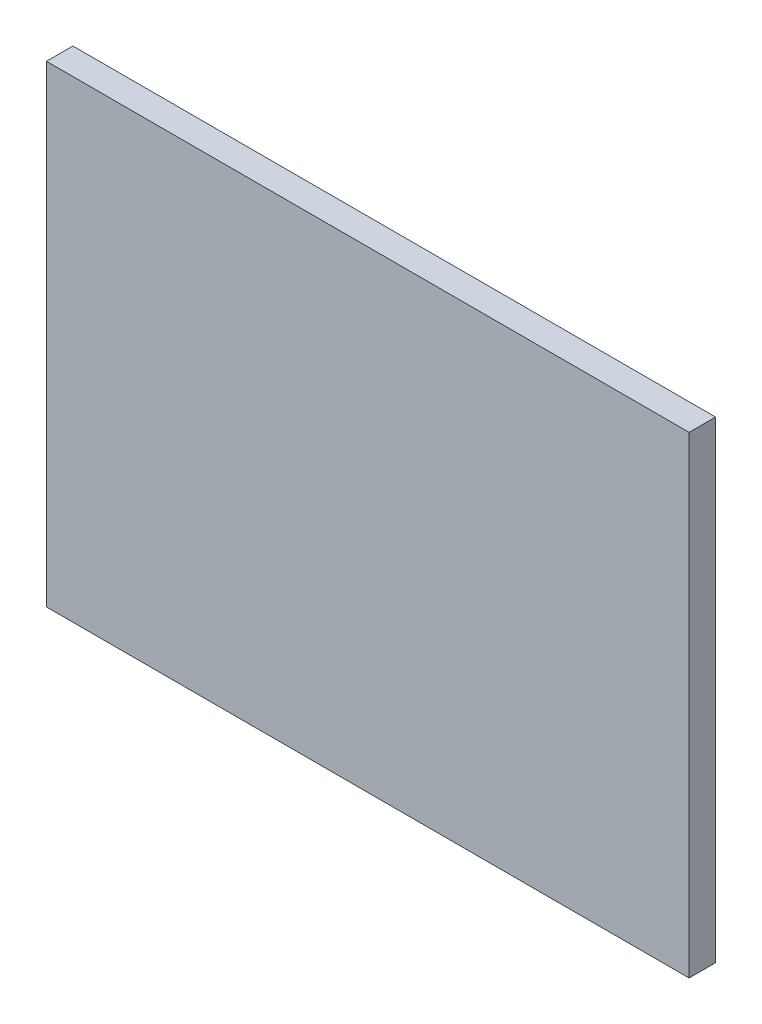
ISO-10303-21;
HEADER;
FILE_DESCRIPTION(('STEP AP214'),'2;1');
FILE_NAME('part.step','',(''),(''),'','','');
FILE_SCHEMA(('AUTOMOTIVE_DESIGN { 1 0 10303 214 1 1 1 1 }'));
ENDSEC;
DATA;
#1=APPLICATION_CONTEXT('core data for automotive mechanical design processes');
#2=APPLICATION_PROTOCOL_DEFINITION('international standard','automotive_design',2000,#1);
#3=PRODUCT_CONTEXT('',#1,'mechanical');
#4=PRODUCT('Part','Part','',(#3));
#5=PRODUCT_RELATED_PRODUCT_CATEGORY('part','',(#4));
#6=PRODUCT_DEFINITION_FORMATION('','',#4);
#7=PRODUCT_DEFINITION_CONTEXT('part definition',#1,'design');
#8=PRODUCT_DEFINITION('design','',#6,#7);
#9=PRODUCT_DEFINITION_SHAPE('','',#8);
#10=(LENGTH_UNIT() NAMED_UNIT(*) SI_UNIT(.MILLI.,.METRE.));
#11=(NAMED_UNIT(*) PLANE_ANGLE_UNIT() SI_UNIT($,.RADIAN.));
#12=(NAMED_UNIT(*) SI_UNIT($,.STERADIAN.) SOLID_ANGLE_UNIT());
#13=UNCERTAINTY_MEASURE_WITH_UNIT(LENGTH_MEASURE(1.E-05),#10,'distance_accuracy_value','');
#14=(GEOMETRIC_REPRESENTATION_CONTEXT(3) GLOBAL_UNCERTAINTY_ASSIGNED_CONTEXT((#13)) GLOBAL_UNIT_ASSIGNED_CONTEXT((#10,
#11,#12)) REPRESENTATION_CONTEXT('',''));
#15=CARTESIAN_POINT('',(0.,0.,0.));
#16=DIRECTION('',(0.,0.,1.));
#17=DIRECTION('',(1.,0.,0.));
#18=AXIS2_PLACEMENT_3D('',#15,#16,#17);
#19=CARTESIAN_POINT('',(-170.,125.,14.));
#20=DIRECTION('',(1.,0.,0.));
#21=DIRECTION('',(0.,0.,-1.));
#22=AXIS2_PLACEMENT_3D('',#19,#20,#21);
#23=PLANE('',#22);
#24=DIRECTION('',(0.,-1.,0.));
#25=VECTOR('',#24,1.);
#26=CARTESIAN_POINT('',(-170.,125.,0.));
#27=LINE('',#26,#25);
#28=CARTESIAN_POINT('',(-170.,125.,0.));
#29=VERTEX_POINT('',#28);
#30=CARTESIAN_POINT('',(-170.,-125.,0.));
#31=VERTEX_POINT('',#30);
#32=EDGE_CURVE('E93',#29,#31,#27,.T.);
#33=ORIENTED_EDGE('',*,*,#32,.T.);
#34=DIRECTION('',(0.,0.,-1.));
#35=VECTOR('',#34,1.);
#36=CARTESIAN_POINT('',(-170.,-125.,14.));
#37=LINE('',#36,#35);
#38=CARTESIAN_POINT('',(-170.,-125.,14.));
#39=VERTEX_POINT('',#38);
#40=EDGE_CURVE('E11',#39,#31,#37,.T.);
#41=ORIENTED_EDGE('',*,*,#40,.F.);
#42=DIRECTION('',(0.,-1.,0.));
#43=VECTOR('',#42,1.);
#44=CARTESIAN_POINT('',(-170.,125.,14.));
#45=LINE('',#44,#43);
#46=CARTESIAN_POINT('',(-170.,125.,14.));
#47=VERTEX_POINT('',#46);
#48=EDGE_CURVE('E81',#47,#39,#45,.T.);
#49=ORIENTED_EDGE('',*,*,#48,.F.);
#50=DIRECTION('',(0.,0.,-1.));
#51=VECTOR('',#50,1.);
#52=CARTESIAN_POINT('',(-170.,125.,14.));
#53=LINE('',#52,#51);
#54=EDGE_CURVE('E89',#47,#29,#53,.T.);
#55=ORIENTED_EDGE('',*,*,#54,.T.);
#56=EDGE_LOOP('',(#33,#41,#49,#55));
#57=FACE_BOUND('',#56,.T.);
#58=ADVANCED_FACE('F30',(#57),#23,.F.);
#59=CARTESIAN_POINT('',(-170.,-125.,14.));
#60=DIRECTION('',(0.,1.,0.));
#61=DIRECTION('',(0.,0.,1.));
#62=AXIS2_PLACEMENT_3D('',#59,#60,#61);
#63=PLANE('',#62);
#64=DIRECTION('',(1.,0.,0.));
#65=VECTOR('',#64,1.);
#66=CARTESIAN_POINT('',(-170.,-125.,0.));
#67=LINE('',#66,#65);
#68=CARTESIAN_POINT('',(170.,-125.,0.));
#69=VERTEX_POINT('',#68);
#70=EDGE_CURVE('E85',#31,#69,#67,.T.);
#71=ORIENTED_EDGE('',*,*,#70,.T.);
#72=DIRECTION('',(0.,0.,-1.));
#73=VECTOR('',#72,1.);
#74=CARTESIAN_POINT('',(170.,-125.,14.));
#75=LINE('',#74,#73);
#76=CARTESIAN_POINT('',(170.,-125.,14.));
#77=VERTEX_POINT('',#76);
#78=EDGE_CURVE('E38',#77,#69,#75,.T.);
#79=ORIENTED_EDGE('',*,*,#78,.F.);
#80=DIRECTION('',(1.,0.,0.));
#81=VECTOR('',#80,1.);
#82=CARTESIAN_POINT('',(-170.,-125.,14.));
#83=LINE('',#82,#81);
#84=EDGE_CURVE('E76',#39,#77,#83,.T.);
#85=ORIENTED_EDGE('',*,*,#84,.F.);
#86=ORIENTED_EDGE('',*,*,#40,.T.);
#87=EDGE_LOOP('',(#71,#79,#85,#86));
#88=FACE_BOUND('',#87,.T.);
#89=ADVANCED_FACE('F84',(#88),#63,.F.);
#90=CARTESIAN_POINT('',(170.,125.,14.));
#91=DIRECTION('',(-1.,0.,0.));
#92=DIRECTION('',(0.,0.,1.));
#93=AXIS2_PLACEMENT_3D('',#90,#91,#92);
#94=PLANE('',#93);
#95=DIRECTION('',(0.,1.,0.));
#96=VECTOR('',#95,1.);
#97=CARTESIAN_POINT('',(170.,125.,0.));
#98=LINE('',#97,#96);
#99=CARTESIAN_POINT('',(170.,125.,0.));
#100=VERTEX_POINT('',#99);
#101=EDGE_CURVE('E63',#69,#100,#98,.T.);
#102=ORIENTED_EDGE('',*,*,#101,.T.);
#103=DIRECTION('',(0.,0.,-1.));
#104=VECTOR('',#103,1.);
#105=CARTESIAN_POINT('',(170.,125.,14.));
#106=LINE('',#105,#104);
#107=CARTESIAN_POINT('',(170.,125.,14.));
#108=VERTEX_POINT('',#107);
#109=EDGE_CURVE('E86',#108,#100,#106,.T.);
#110=ORIENTED_EDGE('',*,*,#109,.F.);
#111=DIRECTION('',(0.,1.,0.));
#112=VECTOR('',#111,1.);
#113=CARTESIAN_POINT('',(170.,125.,14.));
#114=LINE('',#113,#112);
#115=EDGE_CURVE('E79',#77,#108,#114,.T.);
#116=ORIENTED_EDGE('',*,*,#115,.F.);
#117=ORIENTED_EDGE('',*,*,#78,.T.);
#118=EDGE_LOOP('',(#102,#110,#116,#117));
#119=FACE_BOUND('',#118,.T.);
#120=ADVANCED_FACE('F87',(#119),#94,.F.);
#121=CARTESIAN_POINT('',(-170.,125.,14.));
#122=DIRECTION('',(0.,-1.,0.));
#123=DIRECTION('',(0.,0.,-1.));
#124=AXIS2_PLACEMENT_3D('',#121,#122,#123);
#125=PLANE('',#124);
#126=DIRECTION('',(-1.,0.,0.));
#127=VECTOR('',#126,1.);
#128=CARTESIAN_POINT('',(-170.,125.,0.));
#129=LINE('',#128,#127);
#130=EDGE_CURVE('E69',#100,#29,#129,.T.);
#131=ORIENTED_EDGE('',*,*,#130,.T.);
#132=ORIENTED_EDGE('',*,*,#54,.F.);
#133=DIRECTION('',(-1.,0.,0.));
#134=VECTOR('',#133,1.);
#135=CARTESIAN_POINT('',(-170.,125.,14.));
#136=LINE('',#135,#134);
#137=EDGE_CURVE('E46',#108,#47,#136,.T.);
#138=ORIENTED_EDGE('',*,*,#137,.F.);
#139=ORIENTED_EDGE('',*,*,#109,.T.);
#140=EDGE_LOOP('',(#131,#132,#138,#139));
#141=FACE_BOUND('',#140,.T.);
#142=ADVANCED_FACE('F100',(#141),#125,.F.);
#143=CARTESIAN_POINT('',(-170.,-125.,14.));
#144=DIRECTION('',(0.,0.,1.));
#145=DIRECTION('',(1.,0.,0.));
#146=AXIS2_PLACEMENT_3D('',#143,#144,#145);
#147=PLANE('',#146);
#148=ORIENTED_EDGE('',*,*,#48,.T.);
#149=ORIENTED_EDGE('',*,*,#84,.T.);
#150=ORIENTED_EDGE('',*,*,#115,.T.);
#151=ORIENTED_EDGE('',*,*,#137,.T.);
#152=EDGE_LOOP('',(#148,#149,#150,#151));
#153=FACE_BOUND('',#152,.T.);
#154=ADVANCED_FACE('F77',(#153),#147,.T.);
#155=CARTESIAN_POINT('',(-170.,-125.,0.));
#156=DIRECTION('',(0.,0.,1.));
#157=DIRECTION('',(1.,0.,0.));
#158=AXIS2_PLACEMENT_3D('',#155,#156,#157);
#159=PLANE('',#158);
#160=ORIENTED_EDGE('',*,*,#32,.F.);
#161=ORIENTED_EDGE('',*,*,#130,.F.);
#162=ORIENTED_EDGE('',*,*,#101,.F.);
#163=ORIENTED_EDGE('',*,*,#70,.F.);
#164=EDGE_LOOP('',(#160,#161,#162,#163));
#165=FACE_BOUND('',#164,.T.);
#166=ADVANCED_FACE('F103',(#165),#159,.F.);
#167=CLOSED_SHELL('',(#58,#89,#120,#142,#154,#166));
#168=MANIFOLD_SOLID_BREP('B2',#167);
#169=ADVANCED_BREP_SHAPE_REPRESENTATION('',(#18,#168),#14);
#170=SHAPE_DEFINITION_REPRESENTATION(#9,#169);
ENDSEC;
END-ISO-10303-21;
